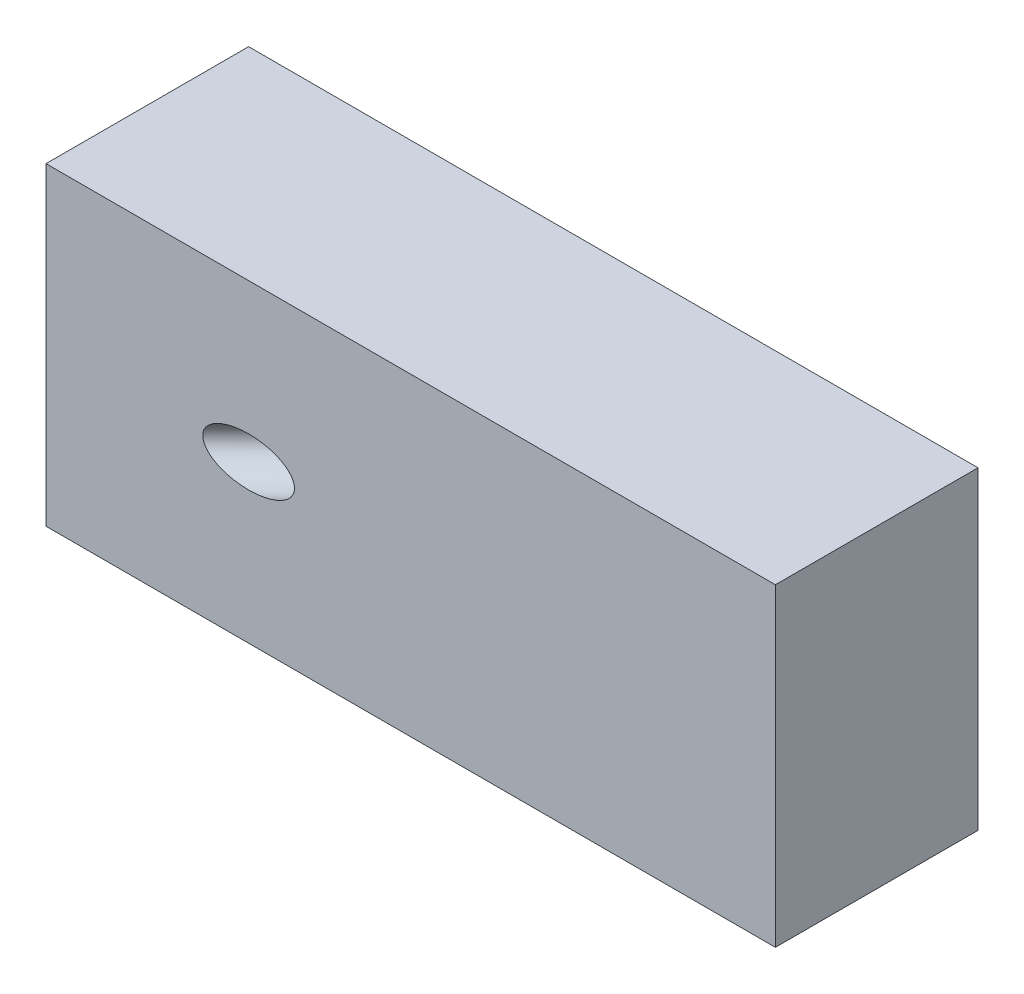
ISO-10303-21;
HEADER;
FILE_DESCRIPTION(('STEP AP214'),'2;1');
FILE_NAME('part.step','',(''),(''),'','','');
FILE_SCHEMA(('AUTOMOTIVE_DESIGN { 1 0 10303 214 1 1 1 1 }'));
ENDSEC;
DATA;
#1=APPLICATION_CONTEXT('core data for automotive mechanical design processes');
#2=APPLICATION_PROTOCOL_DEFINITION('international standard','automotive_design',2000,#1);
#3=PRODUCT_CONTEXT('',#1,'mechanical');
#4=PRODUCT('Part','Part','',(#3));
#5=PRODUCT_RELATED_PRODUCT_CATEGORY('part','',(#4));
#6=PRODUCT_DEFINITION_FORMATION('','',#4);
#7=PRODUCT_DEFINITION_CONTEXT('part definition',#1,'design');
#8=PRODUCT_DEFINITION('design','',#6,#7);
#9=PRODUCT_DEFINITION_SHAPE('','',#8);
#10=(LENGTH_UNIT() NAMED_UNIT(*) SI_UNIT(.MILLI.,.METRE.));
#11=(NAMED_UNIT(*) PLANE_ANGLE_UNIT() SI_UNIT($,.RADIAN.));
#12=(NAMED_UNIT(*) SI_UNIT($,.STERADIAN.) SOLID_ANGLE_UNIT());
#13=UNCERTAINTY_MEASURE_WITH_UNIT(LENGTH_MEASURE(1.E-05),#10,'distance_accuracy_value','');
#14=(GEOMETRIC_REPRESENTATION_CONTEXT(3) GLOBAL_UNCERTAINTY_ASSIGNED_CONTEXT((#13)) GLOBAL_UNIT_ASSIGNED_CONTEXT((#10,
#11,#12)) REPRESENTATION_CONTEXT('',''));
#15=CARTESIAN_POINT('',(0.,0.,0.));
#16=DIRECTION('',(0.,0.,1.));
#17=DIRECTION('',(1.,0.,0.));
#18=AXIS2_PLACEMENT_3D('',#15,#16,#17);
#19=CARTESIAN_POINT('',(0.,0.,0.));
#20=DIRECTION('',(0.,0.,1.));
#21=DIRECTION('',(1.,0.,0.));
#22=AXIS2_PLACEMENT_3D('',#19,#20,#21);
#23=PLANE('',#22);
#24=DIRECTION('',(0.,-1.,0.));
#25=VECTOR('',#24,1.);
#26=CARTESIAN_POINT('',(0.,7.75,0.));
#27=LINE('',#26,#25);
#28=CARTESIAN_POINT('',(0.,7.75,0.));
#29=VERTEX_POINT('',#28);
#30=CARTESIAN_POINT('',(0.,0.,0.));
#31=VERTEX_POINT('',#30);
#32=EDGE_CURVE('E195',#29,#31,#27,.T.);
#33=ORIENTED_EDGE('',*,*,#32,.F.);
#34=DIRECTION('',(-1.,0.,0.));
#35=VECTOR('',#34,1.);
#36=CARTESIAN_POINT('',(0.,7.75,0.));
#37=LINE('',#36,#35);
#38=CARTESIAN_POINT('',(18.,7.75,0.));
#39=VERTEX_POINT('',#38);
#40=EDGE_CURVE('E204',#39,#29,#37,.T.);
#41=ORIENTED_EDGE('',*,*,#40,.F.);
#42=DIRECTION('',(0.,1.,0.));
#43=VECTOR('',#42,1.);
#44=CARTESIAN_POINT('',(18.,7.75,0.));
#45=LINE('',#44,#43);
#46=CARTESIAN_POINT('',(18.,0.,0.));
#47=VERTEX_POINT('',#46);
#48=EDGE_CURVE('E194',#47,#39,#45,.T.);
#49=ORIENTED_EDGE('',*,*,#48,.F.);
#50=DIRECTION('',(1.,0.,0.));
#51=VECTOR('',#50,1.);
#52=CARTESIAN_POINT('',(0.,0.,0.));
#53=LINE('',#52,#51);
#54=EDGE_CURVE('E185',#31,#47,#53,.T.);
#55=ORIENTED_EDGE('',*,*,#54,.F.);
#56=EDGE_LOOP('',(#33,#41,#49,#55));
#57=FACE_BOUND('',#56,.T.);
#58=CARTESIAN_POINT('',(8.86862915010152,3.875,0.));
#59=CARTESIAN_POINT('',(8.86862771781143,3.85440427053259,-6.5479621180761E-13));
#60=CARTESIAN_POINT('',(8.87064904998851,3.83381253152308,-1.67269497313426E-13));
#61=CARTESIAN_POINT('',(8.87828151289731,3.79445368255573,1.58436624794894E-13));
#62=CARTESIAN_POINT('',(8.88369744339823,3.77564764084009,0.));
#63=CARTESIAN_POINT('',(8.89746280961916,3.73911632220586,0.));
#64=CARTESIAN_POINT('',(8.90581926729342,3.72139375257617,0.));
#65=CARTESIAN_POINT('',(8.92897842389906,3.67999530683745,0.));
#66=CARTESIAN_POINT('',(8.94500987337502,3.65701096191798,0.));
#67=CARTESIAN_POINT('',(8.98044493349899,3.61385047591323,0.));
#68=CARTESIAN_POINT('',(8.99985410175264,3.59367906325355,0.));
#69=CARTESIAN_POINT('',(9.0539639237191,3.54401205277469,0.));
#70=CARTESIAN_POINT('',(9.09060078894685,3.51663757914364,0.));
#71=CARTESIAN_POINT('',(9.15656576453623,3.47444070244602,0.));
#72=CARTESIAN_POINT('',(9.18506856237652,3.45824975928616,0.));
#73=CARTESIAN_POINT('',(9.24339737797012,3.4283896871433,0.));
#74=CARTESIAN_POINT('',(9.27322454862745,3.41472281102097,0.));
#75=CARTESIAN_POINT('',(9.36388323284515,3.37715299400843,0.));
#76=CARTESIAN_POINT('',(9.42608904977915,3.35656302242009,0.));
#77=CARTESIAN_POINT('',(9.55231662856689,3.32270262575681,0.));
#78=CARTESIAN_POINT('',(9.61633691612691,3.30942642776104,3.6415488403388E-13));
#79=CARTESIAN_POINT('',(9.74534589598778,3.28931121436707,3.78304396224251E-13));
#80=CARTESIAN_POINT('',(9.81033425711425,3.28247004670977,1.2385126040534E-13));
#81=CARTESIAN_POINT('',(9.94064690133434,3.27481893222654,-1.30774988364794E-13));
#82=CARTESIAN_POINT('',(10.0059711434921,3.27400826708225,-1.30978386546999E-13));
#83=CARTESIAN_POINT('',(10.136426764335,3.27837032045173,1.30982037164892E-13));
#84=CARTESIAN_POINT('',(10.2015581375939,3.28354320573447,3.93153171734876E-13));
#85=CARTESIAN_POINT('',(10.3310429222016,3.30017229572099,-4.14046567927456E-13));
#86=CARTESIAN_POINT('',(10.3953961833113,3.31162969465698,-1.48367056931383E-12));
#87=CARTESIAN_POINT('',(10.5225355888193,3.34154802783353,-1.45147399379676E-12));
#88=CARTESIAN_POINT('',(10.5853209830816,3.36001224852101,-3.48633435423833E-13));
#89=CARTESIAN_POINT('',(10.6976626786739,3.4015076157494,2.96779709313103E-13));
#90=CARTESIAN_POINT('',(10.747677404853,3.42326139800653,0.));
#91=CARTESIAN_POINT('',(10.8337134020054,3.46842031128329,0.));
#92=CARTESIAN_POINT('',(10.8704366355353,3.49047262408322,0.));
#93=CARTESIAN_POINT('',(10.9402090169547,3.53984730526338,0.));
#94=CARTESIAN_POINT('',(10.9732666804828,3.56715703774548,0.));
#95=CARTESIAN_POINT('',(11.0198885689246,3.61458293326345,0.));
#96=CARTESIAN_POINT('',(11.0356198249507,3.63255938354888,0.));
#97=CARTESIAN_POINT('',(11.0643879335086,3.67058679653031,0.));
#98=CARTESIAN_POINT('',(11.0774263507132,3.69063654431581,0.));
#99=CARTESIAN_POINT('',(11.0980143059102,3.72923363502215,0.));
#100=CARTESIAN_POINT('',(11.1061143383184,3.74748387936196,0.));
#101=CARTESIAN_POINT('',(11.1191628594711,3.78505400063875,0.));
#102=CARTESIAN_POINT('',(11.1241189548248,3.80437117202149,0.));
#103=CARTESIAN_POINT('',(11.1304514538099,3.84373875366441,0.));
#104=CARTESIAN_POINT('',(11.1318022085075,3.86379339404008,0.));
#105=CARTESIAN_POINT('',(11.1306964014174,3.90379598556344,0.));
#106=CARTESIAN_POINT('',(11.1282398622965,3.92374393734558,0.));
#107=CARTESIAN_POINT('',(11.1202078021025,3.96093845888433,0.));
#108=CARTESIAN_POINT('',(11.1149609838477,3.97825836810451,0.));
#109=CARTESIAN_POINT('',(11.1019801502003,4.01195951213336,0.));
#110=CARTESIAN_POINT('',(11.0942413394303,4.02833886482123,-1.30010710124403E-13));
#111=CARTESIAN_POINT('',(11.0720186717317,4.0684484456387,-1.87452910732065E-13));
#112=CARTESIAN_POINT('',(11.0561438021196,4.09140643561869,0.));
#113=CARTESIAN_POINT('',(11.0210134619973,4.13453866322175,0.));
#114=CARTESIAN_POINT('',(11.0017513071275,4.15470725307434,0.));
#115=CARTESIAN_POINT('',(10.9481157737145,4.20429238214489,0.));
#116=CARTESIAN_POINT('',(10.911818598213,4.23161687682577,0.));
#117=CARTESIAN_POINT('',(10.8464482359813,4.27376124379923,0.));
#118=CARTESIAN_POINT('',(10.8182008706701,4.28993956283923,0.));
#119=CARTESIAN_POINT('',(10.7603826274832,4.31979635621714,0.));
#120=CARTESIAN_POINT('',(10.7308105771424,4.33347255927505,0.));
#121=CARTESIAN_POINT('',(10.640914150595,4.37109798415276,0.));
#122=CARTESIAN_POINT('',(10.5792135468662,4.39176209757105,1.06948254897137E-13));
#123=CARTESIAN_POINT('',(10.4539856584338,4.4258358913377,-1.06863353075986E-13));
#124=CARTESIAN_POINT('',(10.3904598627414,4.43925131765937,-4.06885500783275E-13));
#125=CARTESIAN_POINT('',(10.262425630693,4.45971105140421,-4.18840853157963E-13));
#126=CARTESIAN_POINT('',(10.1979175336975,4.46675751054957,-1.30972780668668E-13));
#127=CARTESIAN_POINT('',(10.0685459046418,4.47489280424284,1.30956586966797E-13));
#128=CARTESIAN_POINT('',(10.0036824175144,4.47598237529405,1.05056677326726E-13));
#129=CARTESIAN_POINT('',(9.87411689140048,4.47226638487764,-1.11997772365498E-13));
#130=CARTESIAN_POINT('',(9.80941485571513,4.46746070384405,-3.03155664113611E-13));
#131=CARTESIAN_POINT('',(9.68074696111949,4.45168141288175,3.10148251089395E-13));
#132=CARTESIAN_POINT('',(9.61678123310497,4.44070672303541,1.11478440670087E-12));
#133=CARTESIAN_POINT('',(9.49031059836945,4.4119099819334,1.05707683521823E-12));
#134=CARTESIAN_POINT('',(9.42780633927989,4.39408495383537,1.94007742343815E-13));
#135=CARTESIAN_POINT('',(9.33617824422927,4.36125600296637,0.));
#136=CARTESIAN_POINT('',(9.30596394471827,4.349284214991,0.));
#137=CARTESIAN_POINT('',(9.24654727385537,4.32305970892368,0.));
#138=CARTESIAN_POINT('',(9.21734485460436,4.30880709897837,0.));
#139=CARTESIAN_POINT('',(9.14699805246765,4.27044314000949,0.));
#140=CARTESIAN_POINT('',(9.10662224158328,4.24483087720327,0.));
#141=CARTESIAN_POINT('',(9.05465874401161,4.20489346376582,0.));
#142=CARTESIAN_POINT('',(9.04081211373804,4.19348212893077,0.));
#143=CARTESIAN_POINT('',(9.01402363610118,4.16957946159979,0.));
#144=CARTESIAN_POINT('',(9.00108392666865,4.15708572279585,0.));
#145=CARTESIAN_POINT('',(8.9690355598725,4.12320597504996,0.));
#146=CARTESIAN_POINT('',(8.95082471758196,4.10094398456574,2.92254577608635E-13));
#147=CARTESIAN_POINT('',(8.9188130933924,4.05348516535344,-2.90978898585473E-13));
#148=CARTESIAN_POINT('',(8.90499340873262,4.02830157122628,-1.09993155156908E-12));
#149=CARTESIAN_POINT('',(8.88616261780664,3.98214143524395,8.26751235751569E-13));
#150=CARTESIAN_POINT('',(8.87980595805228,3.96171992174369,2.71466248985615E-12));
#151=CARTESIAN_POINT('',(8.87096284855341,3.91921969519197,2.72563249631167E-12));
#152=CARTESIAN_POINT('',(8.86863068752815,3.89710754869873,7.04659592310698E-13));
#153=CARTESIAN_POINT('',(8.86862915010152,3.875,0.));
#154=B_SPLINE_CURVE_WITH_KNOTS('',3,(#58,#59,#60,#61,#62,#63,#64,#65,#66,#67,#68,#69,#70,#71,
#72,#73,#74,#75,#76,#77,#78,#79,#80,#81,#82,#83,#84,#85,#86,#87,#88,#89,#90,#91,#92,#93,#94,#95,
#96,#97,#98,#99,#100,#101,#102,#103,#104,#105,#106,#107,#108,#109,#110,#111,#112,#113,#114,#115,
#116,#117,#118,#119,#120,#121,#122,#123,#124,#125,#126,#127,#128,#129,#130,#131,#132,#133,#134,
#135,#136,#137,#138,#139,#140,#141,#142,#143,#144,#145,#146,#147,#148,#149,#150,#151,#152,#153),
.UNSPECIFIED.,.T.,.F.,(4,2,2,2,2,2,2,2,2,2,2,2,2,2,2,2,2,2,2,2,2,2,2,2,2,2,2,2,2,2,2,2,2,2,2,2,
2,2,2,2,2,2,2,2,2,2,2,4),(0.,0.0616871998823934,0.120116930941494,0.178687149331704,
0.262281226560216,0.346014170563414,0.482443287356364,0.580678102179318,0.679000177341816,
0.874962889227493,1.07077070103949,1.26651299969529,1.46223198229441,1.65795641995554,
1.85371806358939,2.04957164006457,2.21272243142616,2.34091145280606,2.46879614147404,
2.54027722731901,2.6117166615307,2.67138059668041,2.73089962155165,2.79084095895342,
2.85078193949527,2.90485786161378,2.9590384709791,3.04229480187453,3.12571731054713,
3.26124572408101,3.35879682609659,3.4564360448492,3.65103568890564,3.84548084830787,
4.03986029085041,4.23421569998138,4.42857505104311,4.62296843633827,4.81744639176349,
4.91486144495558,5.01227188051833,5.15502480704985,5.20880927762061,5.26271654599943,
5.34862465900623,5.43415778668831,5.49797671240446,5.56419203037346),.UNSPECIFIED.);
#155=CARTESIAN_POINT('',(8.86862915010152,3.875,0.));
#156=VERTEX_POINT('',#155);
#157=EDGE_CURVE('E130',#156,#156,#154,.T.);
#158=ORIENTED_EDGE('',*,*,#157,.T.);
#159=EDGE_LOOP('',(#158));
#160=FACE_BOUND('',#159,.T.);
#161=DIRECTION('',(0.,1.,0.));
#162=VECTOR('',#161,1.);
#163=CARTESIAN_POINT('',(11.4792361250002,2.375,0.));
#164=LINE('',#163,#162);
#165=CARTESIAN_POINT('',(11.4792361250002,2.375,0.));
#166=VERTEX_POINT('',#165);
#167=CARTESIAN_POINT('',(11.4792361250002,5.375,0.));
#168=VERTEX_POINT('',#167);
#169=EDGE_CURVE('E240',#166,#168,#164,.T.);
#170=ORIENTED_EDGE('',*,*,#169,.F.);
#171=CARTESIAN_POINT('',(11.9792361250002,2.375,0.));
#172=DIRECTION('',(0.,0.,1.));
#173=DIRECTION('',(1.,0.,0.));
#174=AXIS2_PLACEMENT_3D('',#171,#172,#173);
#175=CIRCLE('',#174,0.500000000000001);
#176=CARTESIAN_POINT('',(12.4792361250002,2.375,0.));
#177=VERTEX_POINT('',#176);
#178=EDGE_CURVE('E11',#177,#166,#175,.F.);
#179=ORIENTED_EDGE('',*,*,#178,.F.);
#180=DIRECTION('',(0.,1.,0.));
#181=VECTOR('',#180,1.);
#182=CARTESIAN_POINT('',(12.4792361250002,2.375,0.));
#183=LINE('',#182,#181);
#184=CARTESIAN_POINT('',(12.4792361250002,5.375,0.));
#185=VERTEX_POINT('',#184);
#186=EDGE_CURVE('E125',#177,#185,#183,.T.);
#187=ORIENTED_EDGE('',*,*,#186,.T.);
#188=CARTESIAN_POINT('',(11.9792361250002,5.375,0.));
#189=DIRECTION('',(0.,0.,1.));
#190=DIRECTION('',(1.,0.,0.));
#191=AXIS2_PLACEMENT_3D('',#188,#189,#190);
#192=CIRCLE('',#191,0.500000000000001);
#193=EDGE_CURVE('E48',#168,#185,#192,.F.);
#194=ORIENTED_EDGE('',*,*,#193,.F.);
#195=EDGE_LOOP('',(#170,#179,#187,#194));
#196=FACE_BOUND('',#195,.T.);
#197=ADVANCED_FACE('F39',(#57,#160,#196),#23,.F.);
#198=CARTESIAN_POINT('',(11.9792361250002,2.375,-0.55));
#199=DIRECTION('',(0.,0.,1.));
#200=DIRECTION('',(1.,0.,0.));
#201=AXIS2_PLACEMENT_3D('',#198,#199,#200);
#202=CYLINDRICAL_SURFACE('',#201,0.500000000000001);
#203=ORIENTED_EDGE('',*,*,#178,.T.);
#204=DIRECTION('',(0.,0.,1.));
#205=VECTOR('',#204,1.);
#206=CARTESIAN_POINT('',(11.4792361250002,2.375,-1.1));
#207=LINE('',#206,#205);
#208=CARTESIAN_POINT('',(11.4792361250002,2.375,-1.1));
#209=VERTEX_POINT('',#208);
#210=EDGE_CURVE('E112',#209,#166,#207,.T.);
#211=ORIENTED_EDGE('',*,*,#210,.F.);
#212=CARTESIAN_POINT('',(11.9792361250002,2.375,-1.1));
#213=DIRECTION('',(0.,0.,-1.));
#214=DIRECTION('',(-1.,0.,0.));
#215=AXIS2_PLACEMENT_3D('',#212,#213,#214);
#216=CIRCLE('',#215,0.5);
#217=CARTESIAN_POINT('',(12.4792361250002,2.375,-1.1));
#218=VERTEX_POINT('',#217);
#219=EDGE_CURVE('E117',#218,#209,#216,.T.);
#220=ORIENTED_EDGE('',*,*,#219,.F.);
#221=DIRECTION('',(0.,0.,1.));
#222=VECTOR('',#221,1.);
#223=CARTESIAN_POINT('',(12.4792361250002,2.375,-1.1));
#224=LINE('',#223,#222);
#225=EDGE_CURVE('E248',#218,#177,#224,.T.);
#226=ORIENTED_EDGE('',*,*,#225,.T.);
#227=EDGE_LOOP('',(#203,#211,#220,#226));
#228=FACE_BOUND('',#227,.T.);
#229=ADVANCED_FACE('F127',(#228),#202,.T.);
#230=CARTESIAN_POINT('',(0.,7.75,5.));
#231=DIRECTION('',(1.,0.,0.));
#232=DIRECTION('',(0.,1.,0.));
#233=AXIS2_PLACEMENT_3D('',#230,#231,#232);
#234=PLANE('',#233);
#235=ORIENTED_EDGE('',*,*,#32,.T.);
#236=DIRECTION('',(0.,0.,-1.));
#237=VECTOR('',#236,1.);
#238=CARTESIAN_POINT('',(0.,0.,5.));
#239=LINE('',#238,#237);
#240=CARTESIAN_POINT('',(0.,0.,5.));
#241=VERTEX_POINT('',#240);
#242=EDGE_CURVE('E163',#241,#31,#239,.T.);
#243=ORIENTED_EDGE('',*,*,#242,.F.);
#244=DIRECTION('',(0.,-1.,0.));
#245=VECTOR('',#244,1.);
#246=CARTESIAN_POINT('',(0.,7.75,5.));
#247=LINE('',#246,#245);
#248=CARTESIAN_POINT('',(0.,7.75,5.));
#249=VERTEX_POINT('',#248);
#250=EDGE_CURVE('E208',#249,#241,#247,.T.);
#251=ORIENTED_EDGE('',*,*,#250,.F.);
#252=DIRECTION('',(0.,0.,-1.));
#253=VECTOR('',#252,1.);
#254=CARTESIAN_POINT('',(0.,7.75,5.));
#255=LINE('',#254,#253);
#256=EDGE_CURVE('E212',#249,#29,#255,.T.);
#257=ORIENTED_EDGE('',*,*,#256,.T.);
#258=EDGE_LOOP('',(#235,#243,#251,#257));
#259=FACE_BOUND('',#258,.T.);
#260=ADVANCED_FACE('F41',(#259),#234,.F.);
#261=CARTESIAN_POINT('',(0.,0.,5.));
#262=DIRECTION('',(0.,1.,0.));
#263=DIRECTION('',(0.,0.,1.));
#264=AXIS2_PLACEMENT_3D('',#261,#262,#263);
#265=PLANE('',#264);
#266=ORIENTED_EDGE('',*,*,#54,.T.);
#267=DIRECTION('',(0.,0.,-1.));
#268=VECTOR('',#267,1.);
#269=CARTESIAN_POINT('',(18.,0.,5.));
#270=LINE('',#269,#268);
#271=CARTESIAN_POINT('',(18.,0.,5.));
#272=VERTEX_POINT('',#271);
#273=EDGE_CURVE('E187',#272,#47,#270,.T.);
#274=ORIENTED_EDGE('',*,*,#273,.F.);
#275=DIRECTION('',(1.,0.,0.));
#276=VECTOR('',#275,1.);
#277=CARTESIAN_POINT('',(0.,0.,5.));
#278=LINE('',#277,#276);
#279=EDGE_CURVE('E226',#241,#272,#278,.T.);
#280=ORIENTED_EDGE('',*,*,#279,.F.);
#281=ORIENTED_EDGE('',*,*,#242,.T.);
#282=EDGE_LOOP('',(#266,#274,#280,#281));
#283=FACE_BOUND('',#282,.T.);
#284=ADVANCED_FACE('F175',(#283),#265,.F.);
#285=CARTESIAN_POINT('',(18.,7.75,5.));
#286=DIRECTION('',(-1.,0.,0.));
#287=DIRECTION('',(0.,0.,1.));
#288=AXIS2_PLACEMENT_3D('',#285,#286,#287);
#289=PLANE('',#288);
#290=ORIENTED_EDGE('',*,*,#48,.T.);
#291=DIRECTION('',(0.,0.,-1.));
#292=VECTOR('',#291,1.);
#293=CARTESIAN_POINT('',(18.,7.75,5.));
#294=LINE('',#293,#292);
#295=CARTESIAN_POINT('',(18.,7.75,5.));
#296=VERTEX_POINT('',#295);
#297=EDGE_CURVE('E201',#296,#39,#294,.T.);
#298=ORIENTED_EDGE('',*,*,#297,.F.);
#299=DIRECTION('',(0.,1.,0.));
#300=VECTOR('',#299,1.);
#301=CARTESIAN_POINT('',(18.,7.75,5.));
#302=LINE('',#301,#300);
#303=EDGE_CURVE('E199',#272,#296,#302,.T.);
#304=ORIENTED_EDGE('',*,*,#303,.F.);
#305=ORIENTED_EDGE('',*,*,#273,.T.);
#306=EDGE_LOOP('',(#290,#298,#304,#305));
#307=FACE_BOUND('',#306,.T.);
#308=ADVANCED_FACE('F172',(#307),#289,.F.);
#309=CARTESIAN_POINT('',(0.,7.75,5.));
#310=DIRECTION('',(0.,-1.,0.));
#311=DIRECTION('',(1.,0.,0.));
#312=AXIS2_PLACEMENT_3D('',#309,#310,#311);
#313=PLANE('',#312);
#314=ORIENTED_EDGE('',*,*,#40,.T.);
#315=ORIENTED_EDGE('',*,*,#256,.F.);
#316=DIRECTION('',(-1.,0.,0.));
#317=VECTOR('',#316,1.);
#318=CARTESIAN_POINT('',(0.,7.75,5.));
#319=LINE('',#318,#317);
#320=EDGE_CURVE('E216',#296,#249,#319,.T.);
#321=ORIENTED_EDGE('',*,*,#320,.F.);
#322=ORIENTED_EDGE('',*,*,#297,.T.);
#323=EDGE_LOOP('',(#314,#315,#321,#322));
#324=FACE_BOUND('',#323,.T.);
#325=ADVANCED_FACE('F169',(#324),#313,.F.);
#326=CARTESIAN_POINT('',(0.,0.,5.));
#327=DIRECTION('',(0.,0.,1.));
#328=DIRECTION('',(1.,0.,0.));
#329=AXIS2_PLACEMENT_3D('',#326,#327,#328);
#330=PLANE('',#329);
#331=CARTESIAN_POINT('',(3.86862915010152,3.875,5.));
#332=CARTESIAN_POINT('',(3.86862771781144,3.85440427053259,4.99999999999934));
#333=CARTESIAN_POINT('',(3.87064904998851,3.83381253152308,4.99999999999983));
#334=CARTESIAN_POINT('',(3.87828151289731,3.79445368255573,5.00000000000016));
#335=CARTESIAN_POINT('',(3.88369744339823,3.77564764084009,5.00000000000003));
#336=CARTESIAN_POINT('',(3.89746280961916,3.73911632220586,4.99999999999997));
#337=CARTESIAN_POINT('',(3.90581926729342,3.72139375257617,5.00000000000004));
#338=CARTESIAN_POINT('',(3.92897842389906,3.67999530683745,5.00000000000009));
#339=CARTESIAN_POINT('',(3.94500987337502,3.65701096191798,5.00000000000002));
#340=CARTESIAN_POINT('',(3.98044493349899,3.61385047591323,4.99999999999998));
#341=CARTESIAN_POINT('',(3.99985410175264,3.59367906325355,4.99999999999999));
#342=CARTESIAN_POINT('',(4.0539639237191,3.54401205277469,5.00000000000001));
#343=CARTESIAN_POINT('',(4.09060078894685,3.51663757914364,5.));
#344=CARTESIAN_POINT('',(4.15656576453623,3.47444070244602,5.));
#345=CARTESIAN_POINT('',(4.18506856237652,3.45824975928616,5.));
#346=CARTESIAN_POINT('',(4.24339737797011,3.4283896871433,5.));
#347=CARTESIAN_POINT('',(4.27322454862745,3.41472281102097,5.00000000000001));
#348=CARTESIAN_POINT('',(4.36388323284515,3.37715299400843,4.99999999999998));
#349=CARTESIAN_POINT('',(4.42608904977915,3.35656302242009,4.9999999999999));
#350=CARTESIAN_POINT('',(4.55231662856689,3.32270262575681,5.00000000000009));
#351=CARTESIAN_POINT('',(4.61633691612691,3.30942642776105,5.00000000000036));
#352=CARTESIAN_POINT('',(4.74534589598778,3.28931121436708,5.00000000000038));
#353=CARTESIAN_POINT('',(4.81033425711425,3.28247004670977,5.00000000000013));
#354=CARTESIAN_POINT('',(4.94064690133433,3.27481893222654,4.99999999999987));
#355=CARTESIAN_POINT('',(5.00597114349214,3.27400826708225,4.99999999999987));
#356=CARTESIAN_POINT('',(5.13642676433502,3.27837032045173,5.00000000000013));
#357=CARTESIAN_POINT('',(5.20155813759386,3.28354320573447,5.0000000000004));
#358=CARTESIAN_POINT('',(5.33104292220161,3.30017229572099,4.99999999999959));
#359=CARTESIAN_POINT('',(5.39539618331134,3.31162969465698,4.99999999999851));
#360=CARTESIAN_POINT('',(5.52253558881927,3.34154802783353,4.99999999999854));
#361=CARTESIAN_POINT('',(5.58532098308163,3.360012248521,4.99999999999965));
#362=CARTESIAN_POINT('',(5.69766267867394,3.40150761574939,5.0000000000003));
#363=CARTESIAN_POINT('',(5.747677404853,3.42326139800653,5.00000000000007));
#364=CARTESIAN_POINT('',(5.83371340200536,3.46842031128329,4.99999999999995));
#365=CARTESIAN_POINT('',(5.87043663553532,3.49047262408321,4.99999999999999));
#366=CARTESIAN_POINT('',(5.9402090169547,3.53984730526338,5.00000000000001));
#367=CARTESIAN_POINT('',(5.97326668048278,3.56715703774548,4.99999999999999));
#368=CARTESIAN_POINT('',(6.01988856892462,3.61458293326345,4.99999999999999));
#369=CARTESIAN_POINT('',(6.03561982495067,3.63255938354888,5.));
#370=CARTESIAN_POINT('',(6.0643879335086,3.67058679653031,5.));
#371=CARTESIAN_POINT('',(6.07742635071322,3.69063654431581,5.));
#372=CARTESIAN_POINT('',(6.09801430591019,3.72923363502214,5.));
#373=CARTESIAN_POINT('',(6.10611433831836,3.74748387936195,5.));
#374=CARTESIAN_POINT('',(6.11916285947115,3.78505400063874,5.));
#375=CARTESIAN_POINT('',(6.12411895482478,3.80437117202148,5.));
#376=CARTESIAN_POINT('',(6.13045145380992,3.84373875366441,5.));
#377=CARTESIAN_POINT('',(6.13180220850752,3.86379339404008,5.));
#378=CARTESIAN_POINT('',(6.13069640141744,3.90379598556343,5.));
#379=CARTESIAN_POINT('',(6.12823986229652,3.92374393734558,4.99999999999999));
#380=CARTESIAN_POINT('',(6.12020780210247,3.96093845888433,5.00000000000001));
#381=CARTESIAN_POINT('',(6.11496098384768,3.9782583681045,5.00000000000004));
#382=CARTESIAN_POINT('',(6.10198015020035,4.01195951213336,4.99999999999996));
#383=CARTESIAN_POINT('',(6.09424133943025,4.02833886482123,4.99999999999987));
#384=CARTESIAN_POINT('',(6.07201867173172,4.0684484456387,4.99999999999981));
#385=CARTESIAN_POINT('',(6.0561438021196,4.09140643561869,4.99999999999995));
#386=CARTESIAN_POINT('',(6.02101346199726,4.13453866322175,5.00000000000005));
#387=CARTESIAN_POINT('',(6.00175130712747,4.15470725307434,5.00000000000002));
#388=CARTESIAN_POINT('',(5.94811577371452,4.20429238214489,4.99999999999998));
#389=CARTESIAN_POINT('',(5.91181859821304,4.23161687682577,4.99999999999999));
#390=CARTESIAN_POINT('',(5.84644823598127,4.27376124379923,5.00000000000001));
#391=CARTESIAN_POINT('',(5.81820087067007,4.28993956283922,5.));
#392=CARTESIAN_POINT('',(5.76038262748319,4.31979635621714,5.));
#393=CARTESIAN_POINT('',(5.73081057714239,4.33347255927505,4.99999999999999));
#394=CARTESIAN_POINT('',(5.64091415059498,4.37109798415276,5.00000000000002));
#395=CARTESIAN_POINT('',(5.57921354686625,4.39176209757105,5.00000000000011));
#396=CARTESIAN_POINT('',(5.45398565843377,4.4258358913377,4.9999999999999));
#397=CARTESIAN_POINT('',(5.39045986274137,4.43925131765937,4.99999999999959));
#398=CARTESIAN_POINT('',(5.26242563069303,4.45971105140421,4.99999999999958));
#399=CARTESIAN_POINT('',(5.19791753369751,4.46675751054957,4.99999999999987));
#400=CARTESIAN_POINT('',(5.06854590464182,4.47489280424284,5.00000000000013));
#401=CARTESIAN_POINT('',(5.00368241751442,4.47598237529405,5.00000000000011));
#402=CARTESIAN_POINT('',(4.87411689140049,4.47226638487764,4.99999999999989));
#403=CARTESIAN_POINT('',(4.80941485571514,4.46746070384405,4.9999999999997));
#404=CARTESIAN_POINT('',(4.6807469611195,4.45168141288176,5.00000000000031));
#405=CARTESIAN_POINT('',(4.61678123310498,4.44070672303541,5.00000000000112));
#406=CARTESIAN_POINT('',(4.49031059836946,4.4119099819334,5.00000000000106));
#407=CARTESIAN_POINT('',(4.4278063392799,4.39408495383538,5.0000000000002));
#408=CARTESIAN_POINT('',(4.33617824422928,4.36125600296638,4.9999999999999));
#409=CARTESIAN_POINT('',(4.30596394471828,4.349284214991,4.99999999999997));
#410=CARTESIAN_POINT('',(4.24654727385538,4.32305970892369,5.00000000000003));
#411=CARTESIAN_POINT('',(4.21734485460437,4.30880709897838,5.00000000000001));
#412=CARTESIAN_POINT('',(4.14699805246767,4.27044314000949,4.99999999999998));
#413=CARTESIAN_POINT('',(4.10662224158329,4.24483087720328,4.99999999999998));
#414=CARTESIAN_POINT('',(4.05465874401162,4.20489346376582,5.));
#415=CARTESIAN_POINT('',(4.04081211373804,4.19348212893077,5.00000000000001));
#416=CARTESIAN_POINT('',(4.01402363610118,4.1695794615998,4.99999999999999));
#417=CARTESIAN_POINT('',(4.00108392666865,4.15708572279586,4.99999999999996));
#418=CARTESIAN_POINT('',(3.96903555987251,4.12320597504996,5.00000000000006));
#419=CARTESIAN_POINT('',(3.95082471758196,4.10094398456574,5.00000000000029));
#420=CARTESIAN_POINT('',(3.9188130933924,4.05348516535344,4.99999999999971));
#421=CARTESIAN_POINT('',(3.90499340873262,4.02830157122629,4.9999999999989));
#422=CARTESIAN_POINT('',(3.88616261780664,3.98214143524395,5.00000000000083));
#423=CARTESIAN_POINT('',(3.87980595805228,3.96171992174369,5.00000000000272));
#424=CARTESIAN_POINT('',(3.87096284855341,3.91921969519198,5.00000000000273));
#425=CARTESIAN_POINT('',(3.86863068752815,3.89710754869873,5.0000000000007));
#426=CARTESIAN_POINT('',(3.86862915010152,3.875,5.));
#427=B_SPLINE_CURVE_WITH_KNOTS('',3,(#331,#332,#333,#334,#335,#336,#337,#338,#339,#340,#341,
#342,#343,#344,#345,#346,#347,#348,#349,#350,#351,#352,#353,#354,#355,#356,#357,#358,#359,#360,
#361,#362,#363,#364,#365,#366,#367,#368,#369,#370,#371,#372,#373,#374,#375,#376,#377,#378,#379,
#380,#381,#382,#383,#384,#385,#386,#387,#388,#389,#390,#391,#392,#393,#394,#395,#396,#397,#398,
#399,#400,#401,#402,#403,#404,#405,#406,#407,#408,#409,#410,#411,#412,#413,#414,#415,#416,#417,
#418,#419,#420,#421,#422,#423,#424,#425,#426),.UNSPECIFIED.,.T.,.F.,(4,2,2,2,2,2,2,2,2,2,2,2,2,
2,2,2,2,2,2,2,2,2,2,2,2,2,2,2,2,2,2,2,2,2,2,2,2,2,2,2,2,2,2,2,2,2,2,4),(0.,0.0616871998823941,
0.120116930941494,0.178687149331705,0.262281226560215,0.346014170563411,0.482443287356364,
0.580678102179316,0.679000177341814,0.874962889227487,1.07077070103948,1.26651299969528,
1.4622319822944,1.65795641995553,1.85371806358937,2.04957164006456,2.21272243142616,
2.34091145280605,2.46879614147404,2.540277227319,2.6117166615307,2.67138059668041,
2.73089962155164,2.79084095895341,2.85078193949527,2.90485786161377,2.9590384709791,
3.04229480187453,3.12571731054712,3.261245724081,3.35879682609658,3.45643604484919,
3.65103568890563,3.84548084830786,4.03986029085041,4.23421569998137,4.4285750510431,
4.62296843633826,4.81744639176348,4.91486144495557,5.01227188051831,5.15502480704984,
5.2088092776206,5.26271654599943,5.34862465900622,5.43415778668831,5.49797671240445,
5.56419203037346),.UNSPECIFIED.);
#428=CARTESIAN_POINT('',(3.86862915010152,3.875,5.));
#429=VERTEX_POINT('',#428);
#430=EDGE_CURVE('E135',#429,#429,#427,.T.);
#431=ORIENTED_EDGE('',*,*,#430,.F.);
#432=EDGE_LOOP('',(#431));
#433=FACE_BOUND('',#432,.T.);
#434=ORIENTED_EDGE('',*,*,#250,.T.);
#435=ORIENTED_EDGE('',*,*,#279,.T.);
#436=ORIENTED_EDGE('',*,*,#303,.T.);
#437=ORIENTED_EDGE('',*,*,#320,.T.);
#438=EDGE_LOOP('',(#434,#435,#436,#437));
#439=FACE_BOUND('',#438,.T.);
#440=ADVANCED_FACE('F153',(#433,#439),#330,.T.);
#441=CARTESIAN_POINT('',(-2.07106781186548,3.875,12.0710678118655));
#442=DIRECTION('',(0.707106781186547,0.,-0.707106781186548));
#443=DIRECTION('',(-0.707106781186548,0.,-0.707106781186547));
#444=AXIS2_PLACEMENT_3D('',#441,#442,#443);
#445=ELLIPSE('',#444,0.8,0.6);
#446=DIRECTION('',(0.707106781186547,0.,-0.707106781186548));
#447=VECTOR('',#446,1.);
#448=SURFACE_OF_LINEAR_EXTRUSION('',#445,#447);
#449=ORIENTED_EDGE('',*,*,#430,.T.);
#450=EDGE_LOOP('',(#449));
#451=FACE_BOUND('',#450,.T.);
#452=ORIENTED_EDGE('',*,*,#157,.F.);
#453=EDGE_LOOP('',(#452));
#454=FACE_BOUND('',#453,.T.);
#455=ADVANCED_FACE('F148',(#451,#454),#448,.F.);
#456=CARTESIAN_POINT('',(11.9792361250002,5.375,-0.55));
#457=DIRECTION('',(0.,0.,1.));
#458=DIRECTION('',(1.,0.,0.));
#459=AXIS2_PLACEMENT_3D('',#456,#457,#458);
#460=CYLINDRICAL_SURFACE('',#459,0.500000000000001);
#461=ORIENTED_EDGE('',*,*,#193,.T.);
#462=DIRECTION('',(0.,0.,1.));
#463=VECTOR('',#462,1.);
#464=CARTESIAN_POINT('',(12.4792361250002,5.375,-1.1));
#465=LINE('',#464,#463);
#466=CARTESIAN_POINT('',(12.4792361250002,5.375,-1.1));
#467=VERTEX_POINT('',#466);
#468=EDGE_CURVE('E63',#467,#185,#465,.T.);
#469=ORIENTED_EDGE('',*,*,#468,.F.);
#470=CARTESIAN_POINT('',(11.9792361250002,5.375,-1.1));
#471=DIRECTION('',(0.,0.,-1.));
#472=DIRECTION('',(-1.,0.,0.));
#473=AXIS2_PLACEMENT_3D('',#470,#471,#472);
#474=CIRCLE('',#473,0.5);
#475=CARTESIAN_POINT('',(11.4792361250002,5.375,-1.1));
#476=VERTEX_POINT('',#475);
#477=EDGE_CURVE('E116',#476,#467,#474,.T.);
#478=ORIENTED_EDGE('',*,*,#477,.F.);
#479=DIRECTION('',(0.,0.,1.));
#480=VECTOR('',#479,1.);
#481=CARTESIAN_POINT('',(11.4792361250002,5.375,-1.1));
#482=LINE('',#481,#480);
#483=EDGE_CURVE('E55',#476,#168,#482,.T.);
#484=ORIENTED_EDGE('',*,*,#483,.T.);
#485=EDGE_LOOP('',(#461,#469,#478,#484));
#486=FACE_BOUND('',#485,.T.);
#487=ADVANCED_FACE('F152',(#486),#460,.T.);
#488=CARTESIAN_POINT('',(11.4792361250002,2.375,-1.1));
#489=DIRECTION('',(1.,0.,0.));
#490=DIRECTION('',(0.,1.,0.));
#491=AXIS2_PLACEMENT_3D('',#488,#489,#490);
#492=PLANE('',#491);
#493=ORIENTED_EDGE('',*,*,#169,.T.);
#494=ORIENTED_EDGE('',*,*,#483,.F.);
#495=DIRECTION('',(0.,1.,0.));
#496=VECTOR('',#495,1.);
#497=CARTESIAN_POINT('',(11.4792361250002,2.375,-1.1));
#498=LINE('',#497,#496);
#499=EDGE_CURVE('E107',#209,#476,#498,.T.);
#500=ORIENTED_EDGE('',*,*,#499,.F.);
#501=ORIENTED_EDGE('',*,*,#210,.T.);
#502=EDGE_LOOP('',(#493,#494,#500,#501));
#503=FACE_BOUND('',#502,.T.);
#504=ADVANCED_FACE('F110',(#503),#492,.F.);
#505=CARTESIAN_POINT('',(12.4792361250002,2.375,-1.1));
#506=DIRECTION('',(1.,0.,0.));
#507=DIRECTION('',(0.,1.,0.));
#508=AXIS2_PLACEMENT_3D('',#505,#506,#507);
#509=PLANE('',#508);
#510=ORIENTED_EDGE('',*,*,#186,.F.);
#511=ORIENTED_EDGE('',*,*,#225,.F.);
#512=DIRECTION('',(0.,1.,0.));
#513=VECTOR('',#512,1.);
#514=CARTESIAN_POINT('',(12.4792361250002,2.375,-1.1));
#515=LINE('',#514,#513);
#516=EDGE_CURVE('E122',#218,#467,#515,.T.);
#517=ORIENTED_EDGE('',*,*,#516,.T.);
#518=ORIENTED_EDGE('',*,*,#468,.T.);
#519=EDGE_LOOP('',(#510,#511,#517,#518));
#520=FACE_BOUND('',#519,.T.);
#521=ADVANCED_FACE('F253',(#520),#509,.T.);
#522=CARTESIAN_POINT('',(11.9792361250002,2.375,-1.1));
#523=DIRECTION('',(0.,0.,-1.));
#524=DIRECTION('',(-1.,0.,0.));
#525=AXIS2_PLACEMENT_3D('',#522,#523,#524);
#526=PLANE('',#525);
#527=ORIENTED_EDGE('',*,*,#219,.T.);
#528=ORIENTED_EDGE('',*,*,#499,.T.);
#529=ORIENTED_EDGE('',*,*,#477,.T.);
#530=ORIENTED_EDGE('',*,*,#516,.F.);
#531=EDGE_LOOP('',(#527,#528,#529,#530));
#532=FACE_BOUND('',#531,.T.);
#533=ADVANCED_FACE('F121',(#532),#526,.T.);
#534=CLOSED_SHELL('',(#197,#229,#260,#284,#308,#325,#440,#455,#487,#504,#521,#533));
#535=MANIFOLD_SOLID_BREP('B2',#534);
#536=ADVANCED_BREP_SHAPE_REPRESENTATION('',(#18,#535),#14);
#537=SHAPE_DEFINITION_REPRESENTATION(#9,#536);
ENDSEC;
END-ISO-10303-21;
